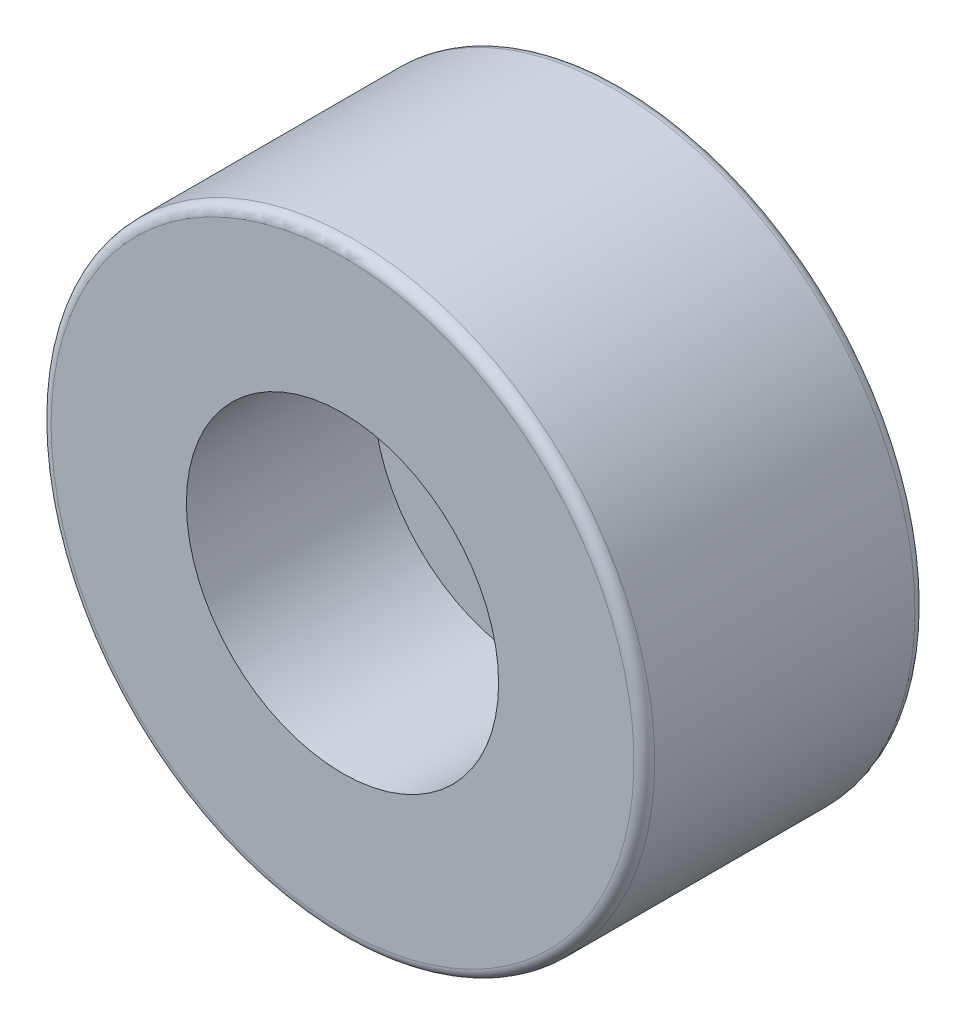
ISO-10303-21;
HEADER;
FILE_DESCRIPTION(('STEP AP214'),'2;1');
FILE_NAME('part.step','',(''),(''),'','','');
FILE_SCHEMA(('AUTOMOTIVE_DESIGN { 1 0 10303 214 1 1 1 1 }'));
ENDSEC;
DATA;
#1=APPLICATION_CONTEXT('core data for automotive mechanical design processes');
#2=APPLICATION_PROTOCOL_DEFINITION('international standard','automotive_design',2000,#1);
#3=PRODUCT_CONTEXT('',#1,'mechanical');
#4=PRODUCT('Part','Part','',(#3));
#5=PRODUCT_RELATED_PRODUCT_CATEGORY('part','',(#4));
#6=PRODUCT_DEFINITION_FORMATION('','',#4);
#7=PRODUCT_DEFINITION_CONTEXT('part definition',#1,'design');
#8=PRODUCT_DEFINITION('design','',#6,#7);
#9=PRODUCT_DEFINITION_SHAPE('','',#8);
#10=(LENGTH_UNIT() NAMED_UNIT(*) SI_UNIT(.MILLI.,.METRE.));
#11=(NAMED_UNIT(*) PLANE_ANGLE_UNIT() SI_UNIT($,.RADIAN.));
#12=(NAMED_UNIT(*) SI_UNIT($,.STERADIAN.) SOLID_ANGLE_UNIT());
#13=UNCERTAINTY_MEASURE_WITH_UNIT(LENGTH_MEASURE(1.E-05),#10,'distance_accuracy_value','');
#14=(GEOMETRIC_REPRESENTATION_CONTEXT(3) GLOBAL_UNCERTAINTY_ASSIGNED_CONTEXT((#13)) GLOBAL_UNIT_ASSIGNED_CONTEXT((#10,
#11,#12)) REPRESENTATION_CONTEXT('',''));
#15=CARTESIAN_POINT('',(0.,0.,0.));
#16=DIRECTION('',(0.,0.,1.));
#17=DIRECTION('',(1.,0.,0.));
#18=AXIS2_PLACEMENT_3D('',#15,#16,#17);
#19=CARTESIAN_POINT('',(0.,0.,0.));
#20=DIRECTION('',(0.,0.,1.));
#21=DIRECTION('',(1.,0.,0.));
#22=AXIS2_PLACEMENT_3D('',#19,#20,#21);
#23=CYLINDRICAL_SURFACE('',#22,1.5);
#24=CARTESIAN_POINT('',(0.,0.,0.));
#25=DIRECTION('',(0.,0.,1.));
#26=DIRECTION('',(1.,0.,0.));
#27=AXIS2_PLACEMENT_3D('',#24,#25,#26);
#28=CIRCLE('',#27,1.5);
#29=CARTESIAN_POINT('',(1.5,0.,0.));
#30=VERTEX_POINT('',#29);
#31=EDGE_CURVE('E62',#30,#30,#28,.T.);
#32=ORIENTED_EDGE('',*,*,#31,.F.);
#33=EDGE_LOOP('',(#32));
#34=FACE_BOUND('',#33,.T.);
#35=CARTESIAN_POINT('',(0.,0.,4.5));
#36=DIRECTION('',(0.,0.,1.));
#37=DIRECTION('',(1.,0.,0.));
#38=AXIS2_PLACEMENT_3D('',#35,#36,#37);
#39=CIRCLE('',#38,1.5);
#40=CARTESIAN_POINT('',(1.5,0.,4.5));
#41=VERTEX_POINT('',#40);
#42=EDGE_CURVE('E73',#41,#41,#39,.T.);
#43=ORIENTED_EDGE('',*,*,#42,.T.);
#44=EDGE_LOOP('',(#43));
#45=FACE_BOUND('',#44,.T.);
#46=ADVANCED_FACE('F37',(#34,#45),#23,.F.);
#47=CARTESIAN_POINT('',(0.,1.5,0.));
#48=DIRECTION('',(0.,0.,1.));
#49=DIRECTION('',(1.,0.,0.));
#50=AXIS2_PLACEMENT_3D('',#47,#48,#49);
#51=PLANE('',#50);
#52=CARTESIAN_POINT('',(0.,0.,0.));
#53=DIRECTION('',(0.,0.,1.));
#54=DIRECTION('',(1.,0.,0.));
#55=AXIS2_PLACEMENT_3D('',#52,#53,#54);
#56=CIRCLE('',#55,14.);
#57=CARTESIAN_POINT('',(14.,0.,0.));
#58=VERTEX_POINT('',#57);
#59=EDGE_CURVE('E45',#58,#58,#56,.F.);
#60=ORIENTED_EDGE('',*,*,#59,.T.);
#61=EDGE_LOOP('',(#60));
#62=FACE_BOUND('',#61,.T.);
#63=ORIENTED_EDGE('',*,*,#31,.T.);
#64=EDGE_LOOP('',(#63));
#65=FACE_BOUND('',#64,.T.);
#66=ADVANCED_FACE('F99',(#62,#65),#51,.F.);
#67=CARTESIAN_POINT('',(0.,0.,0.));
#68=DIRECTION('',(0.,0.,1.));
#69=DIRECTION('',(1.,0.,0.));
#70=AXIS2_PLACEMENT_3D('',#67,#68,#69);
#71=CYLINDRICAL_SURFACE('',#70,14.5);
#72=CARTESIAN_POINT('',(0.,0.,0.5));
#73=DIRECTION('',(0.,0.,1.));
#74=DIRECTION('',(1.,0.,0.));
#75=AXIS2_PLACEMENT_3D('',#72,#73,#74);
#76=CIRCLE('',#75,14.5);
#77=CARTESIAN_POINT('',(14.5,0.,0.5));
#78=VERTEX_POINT('',#77);
#79=EDGE_CURVE('E51',#78,#78,#76,.T.);
#80=ORIENTED_EDGE('',*,*,#79,.T.);
#81=EDGE_LOOP('',(#80));
#82=FACE_BOUND('',#81,.T.);
#83=CARTESIAN_POINT('',(0.,0.,13.));
#84=DIRECTION('',(0.,0.,-1.));
#85=DIRECTION('',(-1.,0.,0.));
#86=AXIS2_PLACEMENT_3D('',#83,#84,#85);
#87=CIRCLE('',#86,14.5);
#88=CARTESIAN_POINT('',(-14.5,0.,13.));
#89=VERTEX_POINT('',#88);
#90=EDGE_CURVE('E57',#89,#89,#87,.T.);
#91=ORIENTED_EDGE('',*,*,#90,.T.);
#92=EDGE_LOOP('',(#91));
#93=FACE_BOUND('',#92,.T.);
#94=ADVANCED_FACE('F94',(#82,#93),#71,.T.);
#95=CARTESIAN_POINT('',(0.,14.5,13.5));
#96=DIRECTION('',(0.,0.,-1.));
#97=DIRECTION('',(-1.,0.,0.));
#98=AXIS2_PLACEMENT_3D('',#95,#96,#97);
#99=PLANE('',#98);
#100=CARTESIAN_POINT('',(0.,0.,13.5));
#101=DIRECTION('',(0.,0.,-1.));
#102=DIRECTION('',(-1.,0.,0.));
#103=AXIS2_PLACEMENT_3D('',#100,#101,#102);
#104=CIRCLE('',#103,14.);
#105=CARTESIAN_POINT('',(-14.,0.,13.5));
#106=VERTEX_POINT('',#105);
#107=EDGE_CURVE('E10',#106,#106,#104,.F.);
#108=ORIENTED_EDGE('',*,*,#107,.T.);
#109=EDGE_LOOP('',(#108));
#110=FACE_BOUND('',#109,.T.);
#111=CARTESIAN_POINT('',(0.,0.,13.5));
#112=DIRECTION('',(0.,0.,1.));
#113=DIRECTION('',(1.,0.,0.));
#114=AXIS2_PLACEMENT_3D('',#111,#112,#113);
#115=CIRCLE('',#114,7.5);
#116=CARTESIAN_POINT('',(7.5,0.,13.5));
#117=VERTEX_POINT('',#116);
#118=EDGE_CURVE('E66',#117,#117,#115,.T.);
#119=ORIENTED_EDGE('',*,*,#118,.F.);
#120=EDGE_LOOP('',(#119));
#121=FACE_BOUND('',#120,.T.);
#122=ADVANCED_FACE('F89',(#110,#121),#99,.F.);
#123=CARTESIAN_POINT('',(0.,0.,0.));
#124=DIRECTION('',(0.,0.,1.));
#125=DIRECTION('',(1.,0.,0.));
#126=AXIS2_PLACEMENT_3D('',#123,#124,#125);
#127=CYLINDRICAL_SURFACE('',#126,7.5);
#128=CARTESIAN_POINT('',(0.,0.,4.5));
#129=DIRECTION('',(0.,0.,1.));
#130=DIRECTION('',(1.,0.,0.));
#131=AXIS2_PLACEMENT_3D('',#128,#129,#130);
#132=CIRCLE('',#131,7.5);
#133=CARTESIAN_POINT('',(7.5,0.,4.5));
#134=VERTEX_POINT('',#133);
#135=EDGE_CURVE('E69',#134,#134,#132,.T.);
#136=ORIENTED_EDGE('',*,*,#135,.F.);
#137=EDGE_LOOP('',(#136));
#138=FACE_BOUND('',#137,.T.);
#139=ORIENTED_EDGE('',*,*,#118,.T.);
#140=EDGE_LOOP('',(#139));
#141=FACE_BOUND('',#140,.T.);
#142=ADVANCED_FACE('F83',(#138,#141),#127,.F.);
#143=CARTESIAN_POINT('',(0.,7.5,4.5));
#144=DIRECTION('',(0.,0.,-1.));
#145=DIRECTION('',(-1.,0.,0.));
#146=AXIS2_PLACEMENT_3D('',#143,#144,#145);
#147=PLANE('',#146);
#148=ORIENTED_EDGE('',*,*,#42,.F.);
#149=EDGE_LOOP('',(#148));
#150=FACE_BOUND('',#149,.T.);
#151=ORIENTED_EDGE('',*,*,#135,.T.);
#152=EDGE_LOOP('',(#151));
#153=FACE_BOUND('',#152,.T.);
#154=ADVANCED_FACE('F79',(#150,#153),#147,.F.);
#155=CARTESIAN_POINT('',(0.,0.,0.5));
#156=DIRECTION('',(0.,0.,1.));
#157=DIRECTION('',(1.,0.,0.));
#158=AXIS2_PLACEMENT_3D('',#155,#156,#157);
#159=TOROIDAL_SURFACE('',#158,14.,0.5);
#160=ORIENTED_EDGE('',*,*,#59,.F.);
#161=EDGE_LOOP('',(#160));
#162=FACE_BOUND('',#161,.T.);
#163=ORIENTED_EDGE('',*,*,#79,.F.);
#164=EDGE_LOOP('',(#163));
#165=FACE_BOUND('',#164,.T.);
#166=ADVANCED_FACE('F82',(#162,#165),#159,.T.);
#167=CARTESIAN_POINT('',(0.,0.,13.));
#168=DIRECTION('',(0.,0.,-1.));
#169=DIRECTION('',(-1.,0.,0.));
#170=AXIS2_PLACEMENT_3D('',#167,#168,#169);
#171=TOROIDAL_SURFACE('',#170,14.,0.5);
#172=ORIENTED_EDGE('',*,*,#90,.F.);
#173=EDGE_LOOP('',(#172));
#174=FACE_BOUND('',#173,.T.);
#175=ORIENTED_EDGE('',*,*,#107,.F.);
#176=EDGE_LOOP('',(#175));
#177=FACE_BOUND('',#176,.T.);
#178=ADVANCED_FACE('F39',(#174,#177),#171,.T.);
#179=CLOSED_SHELL('',(#46,#66,#94,#122,#142,#154,#166,#178));
#180=MANIFOLD_SOLID_BREP('B2',#179);
#181=ADVANCED_BREP_SHAPE_REPRESENTATION('',(#18,#180),#14);
#182=SHAPE_DEFINITION_REPRESENTATION(#9,#181);
ENDSEC;
END-ISO-10303-21;
